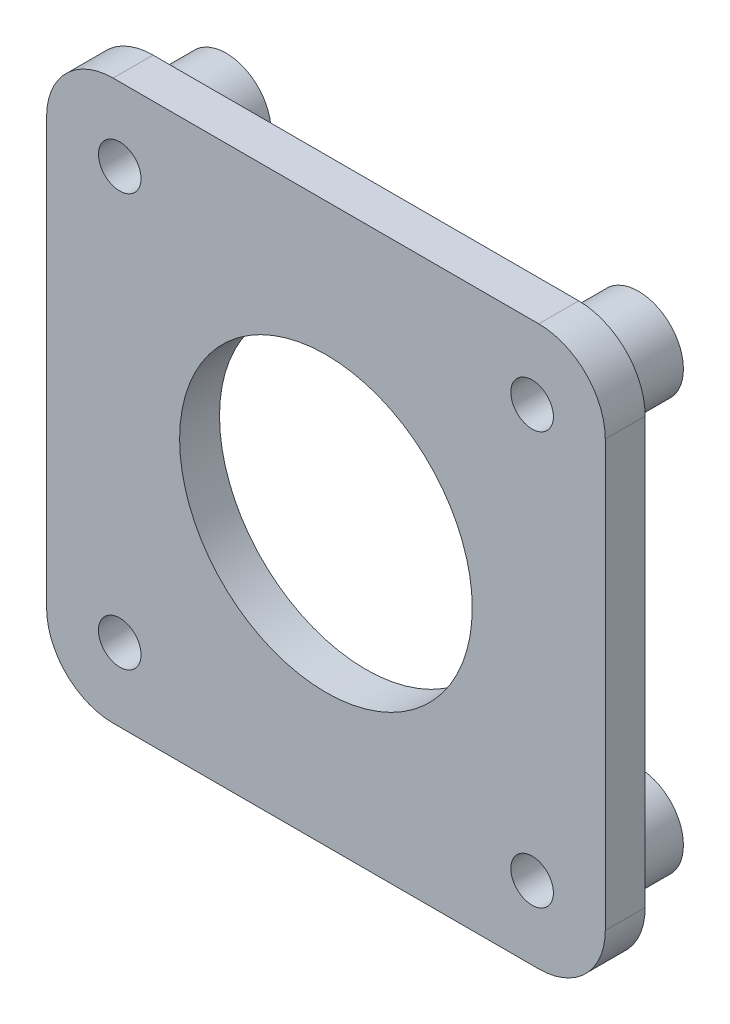
ISO-10303-21;
HEADER;
FILE_DESCRIPTION(('STEP AP214'),'2;1');
FILE_NAME('part.step','',(''),(''),'','','');
FILE_SCHEMA(('AUTOMOTIVE_DESIGN { 1 0 10303 214 1 1 1 1 }'));
ENDSEC;
DATA;
#1=APPLICATION_CONTEXT('core data for automotive mechanical design processes');
#2=APPLICATION_PROTOCOL_DEFINITION('international standard','automotive_design',2000,#1);
#3=PRODUCT_CONTEXT('',#1,'mechanical');
#4=PRODUCT('Part','Part','',(#3));
#5=PRODUCT_RELATED_PRODUCT_CATEGORY('part','',(#4));
#6=PRODUCT_DEFINITION_FORMATION('','',#4);
#7=PRODUCT_DEFINITION_CONTEXT('part definition',#1,'design');
#8=PRODUCT_DEFINITION('design','',#6,#7);
#9=PRODUCT_DEFINITION_SHAPE('','',#8);
#10=(LENGTH_UNIT() NAMED_UNIT(*) SI_UNIT(.MILLI.,.METRE.));
#11=(NAMED_UNIT(*) PLANE_ANGLE_UNIT() SI_UNIT($,.RADIAN.));
#12=(NAMED_UNIT(*) SI_UNIT($,.STERADIAN.) SOLID_ANGLE_UNIT());
#13=UNCERTAINTY_MEASURE_WITH_UNIT(LENGTH_MEASURE(1.E-05),#10,'distance_accuracy_value','');
#14=(GEOMETRIC_REPRESENTATION_CONTEXT(3) GLOBAL_UNCERTAINTY_ASSIGNED_CONTEXT((#13)) GLOBAL_UNIT_ASSIGNED_CONTEXT((#10,
#11,#12)) REPRESENTATION_CONTEXT('',''));
#15=CARTESIAN_POINT('',(0.,0.,0.));
#16=DIRECTION('',(0.,0.,1.));
#17=DIRECTION('',(1.,0.,0.));
#18=AXIS2_PLACEMENT_3D('',#15,#16,#17);
#19=CARTESIAN_POINT('',(-15.5,15.5,3.));
#20=DIRECTION('',(0.,0.,-1.));
#21=DIRECTION('',(-1.,0.,0.));
#22=AXIS2_PLACEMENT_3D('',#19,#20,#21);
#23=CYLINDRICAL_SURFACE('',#22,1.6);
#24=CARTESIAN_POINT('',(-15.5,15.5,3.));
#25=DIRECTION('',(0.,0.,1.));
#26=DIRECTION('',(1.,0.,0.));
#27=AXIS2_PLACEMENT_3D('',#24,#25,#26);
#28=CIRCLE('',#27,1.6);
#29=CARTESIAN_POINT('',(-13.9,15.5,3.));
#30=VERTEX_POINT('',#29);
#31=EDGE_CURVE('E274',#30,#30,#28,.T.);
#32=ORIENTED_EDGE('',*,*,#31,.T.);
#33=EDGE_LOOP('',(#32));
#34=FACE_BOUND('',#33,.T.);
#35=CARTESIAN_POINT('',(-15.5,15.5,-5.));
#36=DIRECTION('',(0.,0.,-1.));
#37=DIRECTION('',(-1.,0.,0.));
#38=AXIS2_PLACEMENT_3D('',#35,#36,#37);
#39=CIRCLE('',#38,1.6);
#40=CARTESIAN_POINT('',(-17.1,15.5,-5.));
#41=VERTEX_POINT('',#40);
#42=EDGE_CURVE('E154',#41,#41,#39,.T.);
#43=ORIENTED_EDGE('',*,*,#42,.T.);
#44=EDGE_LOOP('',(#43));
#45=FACE_BOUND('',#44,.T.);
#46=ADVANCED_FACE('F46',(#34,#45),#23,.F.);
#47=CARTESIAN_POINT('',(-15.5000000000002,-15.4999999999998,3.));
#48=DIRECTION('',(0.,0.,-1.));
#49=DIRECTION('',(-1.,0.,0.));
#50=AXIS2_PLACEMENT_3D('',#47,#48,#49);
#51=CYLINDRICAL_SURFACE('',#50,1.6);
#52=CARTESIAN_POINT('',(-15.5000000000002,-15.4999999999998,3.));
#53=DIRECTION('',(0.,0.,1.));
#54=DIRECTION('',(1.,0.,0.));
#55=AXIS2_PLACEMENT_3D('',#52,#53,#54);
#56=CIRCLE('',#55,1.6);
#57=CARTESIAN_POINT('',(-13.9000000000002,-15.4999999999998,3.));
#58=VERTEX_POINT('',#57);
#59=EDGE_CURVE('E266',#58,#58,#56,.T.);
#60=ORIENTED_EDGE('',*,*,#59,.T.);
#61=EDGE_LOOP('',(#60));
#62=FACE_BOUND('',#61,.T.);
#63=CARTESIAN_POINT('',(-15.5000000000002,-15.4999999999998,-5.));
#64=DIRECTION('',(0.,0.,-1.));
#65=DIRECTION('',(-1.,0.,0.));
#66=AXIS2_PLACEMENT_3D('',#63,#64,#65);
#67=CIRCLE('',#66,1.6);
#68=CARTESIAN_POINT('',(-17.1000000000002,-15.4999999999998,-5.));
#69=VERTEX_POINT('',#68);
#70=EDGE_CURVE('E252',#69,#69,#67,.T.);
#71=ORIENTED_EDGE('',*,*,#70,.T.);
#72=EDGE_LOOP('',(#71));
#73=FACE_BOUND('',#72,.T.);
#74=ADVANCED_FACE('F319',(#62,#73),#51,.F.);
#75=CARTESIAN_POINT('',(15.5000000000001,15.4999999999999,3.));
#76=DIRECTION('',(0.,0.,-1.));
#77=DIRECTION('',(-1.,0.,0.));
#78=AXIS2_PLACEMENT_3D('',#75,#76,#77);
#79=CYLINDRICAL_SURFACE('',#78,1.6);
#80=CARTESIAN_POINT('',(15.5000000000001,15.4999999999999,3.));
#81=DIRECTION('',(0.,0.,1.));
#82=DIRECTION('',(1.,0.,0.));
#83=AXIS2_PLACEMENT_3D('',#80,#81,#82);
#84=CIRCLE('',#83,1.6);
#85=CARTESIAN_POINT('',(17.1000000000001,15.4999999999999,3.));
#86=VERTEX_POINT('',#85);
#87=EDGE_CURVE('E262',#86,#86,#84,.T.);
#88=ORIENTED_EDGE('',*,*,#87,.T.);
#89=EDGE_LOOP('',(#88));
#90=FACE_BOUND('',#89,.T.);
#91=CARTESIAN_POINT('',(15.5000000000001,15.4999999999999,-5.));
#92=DIRECTION('',(0.,0.,-1.));
#93=DIRECTION('',(-1.,0.,0.));
#94=AXIS2_PLACEMENT_3D('',#91,#92,#93);
#95=CIRCLE('',#94,1.6);
#96=CARTESIAN_POINT('',(13.9000000000001,15.4999999999999,-5.));
#97=VERTEX_POINT('',#96);
#98=EDGE_CURVE('E242',#97,#97,#95,.T.);
#99=ORIENTED_EDGE('',*,*,#98,.T.);
#100=EDGE_LOOP('',(#99));
#101=FACE_BOUND('',#100,.T.);
#102=ADVANCED_FACE('F325',(#90,#101),#79,.F.);
#103=CARTESIAN_POINT('',(15.4999999999999,-15.5000000000001,3.));
#104=DIRECTION('',(0.,0.,-1.));
#105=DIRECTION('',(-1.,0.,0.));
#106=AXIS2_PLACEMENT_3D('',#103,#104,#105);
#107=CYLINDRICAL_SURFACE('',#106,1.6);
#108=CARTESIAN_POINT('',(15.4999999999999,-15.5000000000001,3.));
#109=DIRECTION('',(0.,0.,1.));
#110=DIRECTION('',(1.,0.,0.));
#111=AXIS2_PLACEMENT_3D('',#108,#109,#110);
#112=CIRCLE('',#111,1.6);
#113=CARTESIAN_POINT('',(17.0999999999999,-15.5000000000001,3.));
#114=VERTEX_POINT('',#113);
#115=EDGE_CURVE('E164',#114,#114,#112,.T.);
#116=ORIENTED_EDGE('',*,*,#115,.T.);
#117=EDGE_LOOP('',(#116));
#118=FACE_BOUND('',#117,.T.);
#119=CARTESIAN_POINT('',(15.4999999999999,-15.5000000000001,-5.));
#120=DIRECTION('',(0.,0.,-1.));
#121=DIRECTION('',(-1.,0.,0.));
#122=AXIS2_PLACEMENT_3D('',#119,#120,#121);
#123=CIRCLE('',#122,1.6);
#124=CARTESIAN_POINT('',(13.8999999999999,-15.5000000000001,-5.));
#125=VERTEX_POINT('',#124);
#126=EDGE_CURVE('E236',#125,#125,#123,.T.);
#127=ORIENTED_EDGE('',*,*,#126,.T.);
#128=EDGE_LOOP('',(#127));
#129=FACE_BOUND('',#128,.T.);
#130=ADVANCED_FACE('F229',(#118,#129),#107,.F.);
#131=CARTESIAN_POINT('',(15.5000000000001,15.4999999999999,-10.));
#132=DIRECTION('',(0.,0.,1.));
#133=DIRECTION('',(1.,0.,0.));
#134=AXIS2_PLACEMENT_3D('',#131,#132,#133);
#135=CYLINDRICAL_SURFACE('',#134,3.37445140029303);
#136=CARTESIAN_POINT('',(15.5000000000001,15.4999999999999,0.));
#137=DIRECTION('',(0.,0.,1.));
#138=DIRECTION('',(1.,0.,0.));
#139=AXIS2_PLACEMENT_3D('',#136,#137,#138);
#140=CIRCLE('',#139,3.37445140029303);
#141=CARTESIAN_POINT('',(18.8744514002931,15.4999999999999,0.));
#142=VERTEX_POINT('',#141);
#143=EDGE_CURVE('E204',#142,#142,#140,.F.);
#144=ORIENTED_EDGE('',*,*,#143,.T.);
#145=EDGE_LOOP('',(#144));
#146=FACE_BOUND('',#145,.T.);
#147=CARTESIAN_POINT('',(15.5000000000001,15.4999999999999,-5.));
#148=DIRECTION('',(0.,0.,-1.));
#149=DIRECTION('',(-1.,0.,0.));
#150=AXIS2_PLACEMENT_3D('',#147,#148,#149);
#151=CIRCLE('',#150,3.37445140029303);
#152=CARTESIAN_POINT('',(12.125548599707,15.4999999999999,-5.));
#153=VERTEX_POINT('',#152);
#154=EDGE_CURVE('E233',#153,#153,#151,.T.);
#155=ORIENTED_EDGE('',*,*,#154,.F.);
#156=EDGE_LOOP('',(#155));
#157=FACE_BOUND('',#156,.T.);
#158=ADVANCED_FACE('F225',(#146,#157),#135,.T.);
#159=CARTESIAN_POINT('',(-15.5,15.5,-10.));
#160=DIRECTION('',(0.,0.,1.));
#161=DIRECTION('',(1.,0.,0.));
#162=AXIS2_PLACEMENT_3D('',#159,#160,#161);
#163=CYLINDRICAL_SURFACE('',#162,3.37445140029303);
#164=CARTESIAN_POINT('',(-15.5,15.5,0.));
#165=DIRECTION('',(0.,0.,1.));
#166=DIRECTION('',(1.,0.,0.));
#167=AXIS2_PLACEMENT_3D('',#164,#165,#166);
#168=CIRCLE('',#167,3.37445140029303);
#169=CARTESIAN_POINT('',(-12.125548599707,15.5,0.));
#170=VERTEX_POINT('',#169);
#171=EDGE_CURVE('E208',#170,#170,#168,.F.);
#172=ORIENTED_EDGE('',*,*,#171,.T.);
#173=EDGE_LOOP('',(#172));
#174=FACE_BOUND('',#173,.T.);
#175=CARTESIAN_POINT('',(-15.5,15.5,-5.));
#176=DIRECTION('',(0.,0.,-1.));
#177=DIRECTION('',(-1.,0.,0.));
#178=AXIS2_PLACEMENT_3D('',#175,#176,#177);
#179=CIRCLE('',#178,3.37445140029303);
#180=CARTESIAN_POINT('',(-18.874451400293,15.5,-5.));
#181=VERTEX_POINT('',#180);
#182=EDGE_CURVE('E237',#181,#181,#179,.T.);
#183=ORIENTED_EDGE('',*,*,#182,.F.);
#184=EDGE_LOOP('',(#183));
#185=FACE_BOUND('',#184,.T.);
#186=ADVANCED_FACE('F228',(#174,#185),#163,.T.);
#187=CARTESIAN_POINT('',(-15.4999999999999,-15.5000000000001,-10.));
#188=DIRECTION('',(0.,0.,1.));
#189=DIRECTION('',(1.,0.,0.));
#190=AXIS2_PLACEMENT_3D('',#187,#188,#189);
#191=CYLINDRICAL_SURFACE('',#190,3.37445140029303);
#192=CARTESIAN_POINT('',(-15.4999999999999,-15.5000000000001,0.));
#193=DIRECTION('',(0.,0.,1.));
#194=DIRECTION('',(1.,0.,0.));
#195=AXIS2_PLACEMENT_3D('',#192,#193,#194);
#196=CIRCLE('',#195,3.37445140029303);
#197=CARTESIAN_POINT('',(-12.1255485997069,-15.5000000000001,0.));
#198=VERTEX_POINT('',#197);
#199=EDGE_CURVE('E56',#198,#198,#196,.F.);
#200=ORIENTED_EDGE('',*,*,#199,.T.);
#201=EDGE_LOOP('',(#200));
#202=FACE_BOUND('',#201,.T.);
#203=CARTESIAN_POINT('',(-15.4999999999999,-15.5000000000001,-5.));
#204=DIRECTION('',(0.,0.,-1.));
#205=DIRECTION('',(-1.,0.,0.));
#206=AXIS2_PLACEMENT_3D('',#203,#204,#205);
#207=CIRCLE('',#206,3.37445140029303);
#208=CARTESIAN_POINT('',(-18.874451400293,-15.5000000000001,-5.));
#209=VERTEX_POINT('',#208);
#210=EDGE_CURVE('E245',#209,#209,#207,.T.);
#211=ORIENTED_EDGE('',*,*,#210,.F.);
#212=EDGE_LOOP('',(#211));
#213=FACE_BOUND('',#212,.T.);
#214=ADVANCED_FACE('F216',(#202,#213),#191,.T.);
#215=CARTESIAN_POINT('',(15.5000000000001,-15.4999999999999,-10.));
#216=DIRECTION('',(0.,0.,1.));
#217=DIRECTION('',(1.,0.,0.));
#218=AXIS2_PLACEMENT_3D('',#215,#216,#217);
#219=CYLINDRICAL_SURFACE('',#218,3.37445140029303);
#220=CARTESIAN_POINT('',(15.5000000000001,-15.4999999999999,0.));
#221=DIRECTION('',(0.,0.,1.));
#222=DIRECTION('',(1.,0.,0.));
#223=AXIS2_PLACEMENT_3D('',#220,#221,#222);
#224=CIRCLE('',#223,3.37445140029303);
#225=CARTESIAN_POINT('',(18.8744514002931,-15.4999999999999,0.));
#226=VERTEX_POINT('',#225);
#227=EDGE_CURVE('E11',#226,#226,#224,.F.);
#228=ORIENTED_EDGE('',*,*,#227,.T.);
#229=EDGE_LOOP('',(#228));
#230=FACE_BOUND('',#229,.T.);
#231=CARTESIAN_POINT('',(15.5000000000001,-15.4999999999999,-5.));
#232=DIRECTION('',(0.,0.,-1.));
#233=DIRECTION('',(-1.,0.,0.));
#234=AXIS2_PLACEMENT_3D('',#231,#232,#233);
#235=CIRCLE('',#234,3.37445140029303);
#236=CARTESIAN_POINT('',(12.1255485997071,-15.4999999999999,-5.));
#237=VERTEX_POINT('',#236);
#238=EDGE_CURVE('E50',#237,#237,#235,.T.);
#239=ORIENTED_EDGE('',*,*,#238,.F.);
#240=EDGE_LOOP('',(#239));
#241=FACE_BOUND('',#240,.T.);
#242=ADVANCED_FACE('F221',(#230,#241),#219,.T.);
#243=CARTESIAN_POINT('',(0.,0.,0.));
#244=DIRECTION('',(0.,0.,1.));
#245=DIRECTION('',(1.,0.,0.));
#246=AXIS2_PLACEMENT_3D('',#243,#244,#245);
#247=PLANE('',#246);
#248=ORIENTED_EDGE('',*,*,#199,.F.);
#249=EDGE_LOOP('',(#248));
#250=FACE_BOUND('',#249,.T.);
#251=ORIENTED_EDGE('',*,*,#143,.F.);
#252=EDGE_LOOP('',(#251));
#253=FACE_BOUND('',#252,.T.);
#254=DIRECTION('',(1.,0.,0.));
#255=VECTOR('',#254,1.);
#256=CARTESIAN_POINT('',(0.,-21.,0.));
#257=LINE('',#256,#255);
#258=CARTESIAN_POINT('',(-16.,-21.,0.));
#259=VERTEX_POINT('',#258);
#260=CARTESIAN_POINT('',(16.,-21.,0.));
#261=VERTEX_POINT('',#260);
#262=EDGE_CURVE('E133',#259,#261,#257,.T.);
#263=ORIENTED_EDGE('',*,*,#262,.F.);
#264=CARTESIAN_POINT('',(-16.,-16.,0.));
#265=DIRECTION('',(0.,0.,1.));
#266=DIRECTION('',(1.,0.,0.));
#267=AXIS2_PLACEMENT_3D('',#264,#265,#266);
#268=CIRCLE('',#267,5.);
#269=CARTESIAN_POINT('',(-21.,-16.,0.));
#270=VERTEX_POINT('',#269);
#271=EDGE_CURVE('E115',#259,#270,#268,.F.);
#272=ORIENTED_EDGE('',*,*,#271,.T.);
#273=DIRECTION('',(0.,1.,0.));
#274=VECTOR('',#273,1.);
#275=CARTESIAN_POINT('',(-21.,0.,0.));
#276=LINE('',#275,#274);
#277=CARTESIAN_POINT('',(-21.,16.,0.));
#278=VERTEX_POINT('',#277);
#279=EDGE_CURVE('E161',#270,#278,#276,.T.);
#280=ORIENTED_EDGE('',*,*,#279,.T.);
#281=CARTESIAN_POINT('',(-16.,16.,0.));
#282=DIRECTION('',(0.,0.,1.));
#283=DIRECTION('',(1.,0.,0.));
#284=AXIS2_PLACEMENT_3D('',#281,#282,#283);
#285=CIRCLE('',#284,5.);
#286=CARTESIAN_POINT('',(-16.,21.,0.));
#287=VERTEX_POINT('',#286);
#288=EDGE_CURVE('E138',#278,#287,#285,.F.);
#289=ORIENTED_EDGE('',*,*,#288,.T.);
#290=DIRECTION('',(1.,0.,0.));
#291=VECTOR('',#290,1.);
#292=CARTESIAN_POINT('',(0.,21.,0.));
#293=LINE('',#292,#291);
#294=CARTESIAN_POINT('',(16.,21.,0.));
#295=VERTEX_POINT('',#294);
#296=EDGE_CURVE('E151',#287,#295,#293,.T.);
#297=ORIENTED_EDGE('',*,*,#296,.T.);
#298=CARTESIAN_POINT('',(16.,16.,0.));
#299=DIRECTION('',(0.,0.,1.));
#300=DIRECTION('',(1.,0.,0.));
#301=AXIS2_PLACEMENT_3D('',#298,#299,#300);
#302=CIRCLE('',#301,5.);
#303=CARTESIAN_POINT('',(21.,16.,0.));
#304=VERTEX_POINT('',#303);
#305=EDGE_CURVE('E170',#295,#304,#302,.F.);
#306=ORIENTED_EDGE('',*,*,#305,.T.);
#307=DIRECTION('',(0.,1.,0.));
#308=VECTOR('',#307,1.);
#309=CARTESIAN_POINT('',(21.,0.,0.));
#310=LINE('',#309,#308);
#311=CARTESIAN_POINT('',(21.,-16.,0.));
#312=VERTEX_POINT('',#311);
#313=EDGE_CURVE('E145',#312,#304,#310,.T.);
#314=ORIENTED_EDGE('',*,*,#313,.F.);
#315=CARTESIAN_POINT('',(16.,-16.,0.));
#316=DIRECTION('',(0.,0.,1.));
#317=DIRECTION('',(1.,0.,0.));
#318=AXIS2_PLACEMENT_3D('',#315,#316,#317);
#319=CIRCLE('',#318,5.);
#320=EDGE_CURVE('E127',#312,#261,#319,.F.);
#321=ORIENTED_EDGE('',*,*,#320,.T.);
#322=EDGE_LOOP('',(#263,#272,#280,#289,#297,#306,#314,#321));
#323=FACE_BOUND('',#322,.T.);
#324=CARTESIAN_POINT('',(0.,0.,0.));
#325=DIRECTION('',(0.,0.,1.));
#326=DIRECTION('',(1.,0.,0.));
#327=AXIS2_PLACEMENT_3D('',#324,#325,#326);
#328=CIRCLE('',#327,11.);
#329=CARTESIAN_POINT('',(11.,0.,0.));
#330=VERTEX_POINT('',#329);
#331=EDGE_CURVE('E146',#330,#330,#328,.T.);
#332=ORIENTED_EDGE('',*,*,#331,.T.);
#333=EDGE_LOOP('',(#332));
#334=FACE_BOUND('',#333,.T.);
#335=ORIENTED_EDGE('',*,*,#171,.F.);
#336=EDGE_LOOP('',(#335));
#337=FACE_BOUND('',#336,.T.);
#338=ORIENTED_EDGE('',*,*,#227,.F.);
#339=EDGE_LOOP('',(#338));
#340=FACE_BOUND('',#339,.T.);
#341=ADVANCED_FACE('F141',(#250,#253,#323,#334,#337,#340),#247,.F.);
#342=CARTESIAN_POINT('',(0.,-21.,3.));
#343=DIRECTION('',(0.,1.,0.));
#344=DIRECTION('',(0.,0.,1.));
#345=AXIS2_PLACEMENT_3D('',#342,#343,#344);
#346=PLANE('',#345);
#347=DIRECTION('',(1.,0.,0.));
#348=VECTOR('',#347,1.);
#349=CARTESIAN_POINT('',(0.,-21.,3.));
#350=LINE('',#349,#348);
#351=CARTESIAN_POINT('',(-16.,-21.,3.));
#352=VERTEX_POINT('',#351);
#353=CARTESIAN_POINT('',(16.,-21.,3.));
#354=VERTEX_POINT('',#353);
#355=EDGE_CURVE('E136',#352,#354,#350,.T.);
#356=ORIENTED_EDGE('',*,*,#355,.F.);
#357=DIRECTION('',(0.,0.,-1.));
#358=VECTOR('',#357,1.);
#359=CARTESIAN_POINT('',(-16.,-21.,0.));
#360=LINE('',#359,#358);
#361=EDGE_CURVE('E119',#352,#259,#360,.T.);
#362=ORIENTED_EDGE('',*,*,#361,.T.);
#363=ORIENTED_EDGE('',*,*,#262,.T.);
#364=DIRECTION('',(0.,0.,-1.));
#365=VECTOR('',#364,1.);
#366=CARTESIAN_POINT('',(16.,-21.,3.));
#367=LINE('',#366,#365);
#368=EDGE_CURVE('E139',#261,#354,#367,.F.);
#369=ORIENTED_EDGE('',*,*,#368,.T.);
#370=EDGE_LOOP('',(#356,#362,#363,#369));
#371=FACE_BOUND('',#370,.T.);
#372=ADVANCED_FACE('F132',(#371),#346,.F.);
#373=CARTESIAN_POINT('',(21.,0.,3.));
#374=DIRECTION('',(-1.,0.,0.));
#375=DIRECTION('',(0.,0.,1.));
#376=AXIS2_PLACEMENT_3D('',#373,#374,#375);
#377=PLANE('',#376);
#378=DIRECTION('',(0.,1.,0.));
#379=VECTOR('',#378,1.);
#380=CARTESIAN_POINT('',(21.,0.,3.));
#381=LINE('',#380,#379);
#382=CARTESIAN_POINT('',(21.,-16.,3.));
#383=VERTEX_POINT('',#382);
#384=CARTESIAN_POINT('',(21.,16.,3.));
#385=VERTEX_POINT('',#384);
#386=EDGE_CURVE('E280',#383,#385,#381,.T.);
#387=ORIENTED_EDGE('',*,*,#386,.F.);
#388=DIRECTION('',(0.,0.,-1.));
#389=VECTOR('',#388,1.);
#390=CARTESIAN_POINT('',(21.,-16.,3.));
#391=LINE('',#390,#389);
#392=EDGE_CURVE('E194',#383,#312,#391,.T.);
#393=ORIENTED_EDGE('',*,*,#392,.T.);
#394=ORIENTED_EDGE('',*,*,#313,.T.);
#395=DIRECTION('',(0.,0.,-1.));
#396=VECTOR('',#395,1.);
#397=CARTESIAN_POINT('',(21.,16.,3.));
#398=LINE('',#397,#396);
#399=EDGE_CURVE('E191',#304,#385,#398,.F.);
#400=ORIENTED_EDGE('',*,*,#399,.T.);
#401=EDGE_LOOP('',(#387,#393,#394,#400));
#402=FACE_BOUND('',#401,.T.);
#403=ADVANCED_FACE('F300',(#402),#377,.F.);
#404=CARTESIAN_POINT('',(0.,21.,3.));
#405=DIRECTION('',(0.,1.,0.));
#406=DIRECTION('',(0.,0.,1.));
#407=AXIS2_PLACEMENT_3D('',#404,#405,#406);
#408=PLANE('',#407);
#409=DIRECTION('',(1.,0.,0.));
#410=VECTOR('',#409,1.);
#411=CARTESIAN_POINT('',(0.,21.,3.));
#412=LINE('',#411,#410);
#413=CARTESIAN_POINT('',(-16.,21.,3.));
#414=VERTEX_POINT('',#413);
#415=CARTESIAN_POINT('',(16.,21.,3.));
#416=VERTEX_POINT('',#415);
#417=EDGE_CURVE('E283',#414,#416,#412,.T.);
#418=ORIENTED_EDGE('',*,*,#417,.T.);
#419=DIRECTION('',(0.,0.,-1.));
#420=VECTOR('',#419,1.);
#421=CARTESIAN_POINT('',(16.,21.,0.));
#422=LINE('',#421,#420);
#423=EDGE_CURVE('E200',#416,#295,#422,.T.);
#424=ORIENTED_EDGE('',*,*,#423,.T.);
#425=ORIENTED_EDGE('',*,*,#296,.F.);
#426=DIRECTION('',(0.,0.,-1.));
#427=VECTOR('',#426,1.);
#428=CARTESIAN_POINT('',(-16.,21.,3.));
#429=LINE('',#428,#427);
#430=EDGE_CURVE('E70',#287,#414,#429,.F.);
#431=ORIENTED_EDGE('',*,*,#430,.T.);
#432=EDGE_LOOP('',(#418,#424,#425,#431));
#433=FACE_BOUND('',#432,.T.);
#434=ADVANCED_FACE('F293',(#433),#408,.T.);
#435=CARTESIAN_POINT('',(0.,0.,3.));
#436=DIRECTION('',(0.,0.,-1.));
#437=DIRECTION('',(-1.,0.,0.));
#438=AXIS2_PLACEMENT_3D('',#435,#436,#437);
#439=CYLINDRICAL_SURFACE('',#438,11.);
#440=CARTESIAN_POINT('',(0.,0.,3.));
#441=DIRECTION('',(0.,0.,1.));
#442=DIRECTION('',(1.,0.,0.));
#443=AXIS2_PLACEMENT_3D('',#440,#441,#442);
#444=CIRCLE('',#443,11.);
#445=CARTESIAN_POINT('',(11.,0.,3.));
#446=VERTEX_POINT('',#445);
#447=EDGE_CURVE('E270',#446,#446,#444,.T.);
#448=ORIENTED_EDGE('',*,*,#447,.T.);
#449=EDGE_LOOP('',(#448));
#450=FACE_BOUND('',#449,.T.);
#451=ORIENTED_EDGE('',*,*,#331,.F.);
#452=EDGE_LOOP('',(#451));
#453=FACE_BOUND('',#452,.T.);
#454=ADVANCED_FACE('F314',(#450,#453),#439,.F.);
#455=CARTESIAN_POINT('',(-21.,0.,3.));
#456=DIRECTION('',(-1.,0.,0.));
#457=DIRECTION('',(0.,0.,1.));
#458=AXIS2_PLACEMENT_3D('',#455,#456,#457);
#459=PLANE('',#458);
#460=ORIENTED_EDGE('',*,*,#279,.F.);
#461=DIRECTION('',(0.,0.,-1.));
#462=VECTOR('',#461,1.);
#463=CARTESIAN_POINT('',(-21.,-16.,3.));
#464=LINE('',#463,#462);
#465=CARTESIAN_POINT('',(-21.,-16.,3.));
#466=VERTEX_POINT('',#465);
#467=EDGE_CURVE('E120',#270,#466,#464,.F.);
#468=ORIENTED_EDGE('',*,*,#467,.T.);
#469=DIRECTION('',(0.,1.,0.));
#470=VECTOR('',#469,1.);
#471=CARTESIAN_POINT('',(-21.,0.,3.));
#472=LINE('',#471,#470);
#473=CARTESIAN_POINT('',(-21.,16.,3.));
#474=VERTEX_POINT('',#473);
#475=EDGE_CURVE('E166',#466,#474,#472,.T.);
#476=ORIENTED_EDGE('',*,*,#475,.T.);
#477=DIRECTION('',(0.,0.,-1.));
#478=VECTOR('',#477,1.);
#479=CARTESIAN_POINT('',(-21.,16.,3.));
#480=LINE('',#479,#478);
#481=EDGE_CURVE('E126',#474,#278,#480,.T.);
#482=ORIENTED_EDGE('',*,*,#481,.T.);
#483=EDGE_LOOP('',(#460,#468,#476,#482));
#484=FACE_BOUND('',#483,.T.);
#485=ADVANCED_FACE('F290',(#484),#459,.T.);
#486=CARTESIAN_POINT('',(0.,0.,3.));
#487=DIRECTION('',(0.,0.,1.));
#488=DIRECTION('',(1.,0.,0.));
#489=AXIS2_PLACEMENT_3D('',#486,#487,#488);
#490=PLANE('',#489);
#491=ORIENTED_EDGE('',*,*,#115,.F.);
#492=EDGE_LOOP('',(#491));
#493=FACE_BOUND('',#492,.T.);
#494=ORIENTED_EDGE('',*,*,#87,.F.);
#495=EDGE_LOOP('',(#494));
#496=FACE_BOUND('',#495,.T.);
#497=ORIENTED_EDGE('',*,*,#59,.F.);
#498=EDGE_LOOP('',(#497));
#499=FACE_BOUND('',#498,.T.);
#500=ORIENTED_EDGE('',*,*,#447,.F.);
#501=EDGE_LOOP('',(#500));
#502=FACE_BOUND('',#501,.T.);
#503=ORIENTED_EDGE('',*,*,#31,.F.);
#504=EDGE_LOOP('',(#503));
#505=FACE_BOUND('',#504,.T.);
#506=ORIENTED_EDGE('',*,*,#475,.F.);
#507=CARTESIAN_POINT('',(-16.,-16.,3.));
#508=DIRECTION('',(0.,0.,1.));
#509=DIRECTION('',(1.,0.,0.));
#510=AXIS2_PLACEMENT_3D('',#507,#508,#509);
#511=CIRCLE('',#510,5.);
#512=EDGE_CURVE('E188',#466,#352,#511,.T.);
#513=ORIENTED_EDGE('',*,*,#512,.T.);
#514=ORIENTED_EDGE('',*,*,#355,.T.);
#515=CARTESIAN_POINT('',(16.,-16.,3.));
#516=DIRECTION('',(0.,0.,1.));
#517=DIRECTION('',(1.,0.,0.));
#518=AXIS2_PLACEMENT_3D('',#515,#516,#517);
#519=CIRCLE('',#518,5.);
#520=EDGE_CURVE('E185',#354,#383,#519,.T.);
#521=ORIENTED_EDGE('',*,*,#520,.T.);
#522=ORIENTED_EDGE('',*,*,#386,.T.);
#523=CARTESIAN_POINT('',(16.,16.,3.));
#524=DIRECTION('',(0.,0.,1.));
#525=DIRECTION('',(1.,0.,0.));
#526=AXIS2_PLACEMENT_3D('',#523,#524,#525);
#527=CIRCLE('',#526,5.);
#528=EDGE_CURVE('E63',#385,#416,#527,.T.);
#529=ORIENTED_EDGE('',*,*,#528,.T.);
#530=ORIENTED_EDGE('',*,*,#417,.F.);
#531=CARTESIAN_POINT('',(-16.,16.,3.));
#532=DIRECTION('',(0.,0.,1.));
#533=DIRECTION('',(1.,0.,0.));
#534=AXIS2_PLACEMENT_3D('',#531,#532,#533);
#535=CIRCLE('',#534,5.);
#536=EDGE_CURVE('E180',#414,#474,#535,.T.);
#537=ORIENTED_EDGE('',*,*,#536,.T.);
#538=EDGE_LOOP('',(#506,#513,#514,#521,#522,#529,#530,#537));
#539=FACE_BOUND('',#538,.T.);
#540=ADVANCED_FACE('F305',(#493,#496,#499,#502,#505,#539),#490,.T.);
#541=CARTESIAN_POINT('',(-16.,-16.,3.));
#542=DIRECTION('',(0.,0.,1.));
#543=DIRECTION('',(1.,0.,0.));
#544=AXIS2_PLACEMENT_3D('',#541,#542,#543);
#545=CYLINDRICAL_SURFACE('',#544,5.);
#546=ORIENTED_EDGE('',*,*,#512,.F.);
#547=ORIENTED_EDGE('',*,*,#467,.F.);
#548=ORIENTED_EDGE('',*,*,#271,.F.);
#549=ORIENTED_EDGE('',*,*,#361,.F.);
#550=EDGE_LOOP('',(#546,#547,#548,#549));
#551=FACE_BOUND('',#550,.T.);
#552=ADVANCED_FACE('F118',(#551),#545,.T.);
#553=CARTESIAN_POINT('',(16.,-16.,3.));
#554=DIRECTION('',(0.,0.,-1.));
#555=DIRECTION('',(-1.,0.,0.));
#556=AXIS2_PLACEMENT_3D('',#553,#554,#555);
#557=CYLINDRICAL_SURFACE('',#556,5.);
#558=ORIENTED_EDGE('',*,*,#520,.F.);
#559=ORIENTED_EDGE('',*,*,#368,.F.);
#560=ORIENTED_EDGE('',*,*,#320,.F.);
#561=ORIENTED_EDGE('',*,*,#392,.F.);
#562=EDGE_LOOP('',(#558,#559,#560,#561));
#563=FACE_BOUND('',#562,.T.);
#564=ADVANCED_FACE('F304',(#563),#557,.T.);
#565=CARTESIAN_POINT('',(16.,16.,3.));
#566=DIRECTION('',(0.,0.,1.));
#567=DIRECTION('',(1.,0.,0.));
#568=AXIS2_PLACEMENT_3D('',#565,#566,#567);
#569=CYLINDRICAL_SURFACE('',#568,5.);
#570=ORIENTED_EDGE('',*,*,#528,.F.);
#571=ORIENTED_EDGE('',*,*,#399,.F.);
#572=ORIENTED_EDGE('',*,*,#305,.F.);
#573=ORIENTED_EDGE('',*,*,#423,.F.);
#574=EDGE_LOOP('',(#570,#571,#572,#573));
#575=FACE_BOUND('',#574,.T.);
#576=ADVANCED_FACE('F296',(#575),#569,.T.);
#577=CARTESIAN_POINT('',(-16.,16.,3.));
#578=DIRECTION('',(0.,0.,-1.));
#579=DIRECTION('',(-1.,0.,0.));
#580=AXIS2_PLACEMENT_3D('',#577,#578,#579);
#581=CYLINDRICAL_SURFACE('',#580,5.);
#582=ORIENTED_EDGE('',*,*,#536,.F.);
#583=ORIENTED_EDGE('',*,*,#430,.F.);
#584=ORIENTED_EDGE('',*,*,#288,.F.);
#585=ORIENTED_EDGE('',*,*,#481,.F.);
#586=EDGE_LOOP('',(#582,#583,#584,#585));
#587=FACE_BOUND('',#586,.T.);
#588=ADVANCED_FACE('F48',(#587),#581,.T.);
#589=CARTESIAN_POINT('',(0.,0.,-5.));
#590=DIRECTION('',(0.,0.,-1.));
#591=DIRECTION('',(-1.,0.,0.));
#592=AXIS2_PLACEMENT_3D('',#589,#590,#591);
#593=PLANE('',#592);
#594=ORIENTED_EDGE('',*,*,#126,.F.);
#595=EDGE_LOOP('',(#594));
#596=FACE_BOUND('',#595,.T.);
#597=ORIENTED_EDGE('',*,*,#238,.T.);
#598=EDGE_LOOP('',(#597));
#599=FACE_BOUND('',#598,.T.);
#600=ADVANCED_FACE('F346',(#596,#599),#593,.T.);
#601=ORIENTED_EDGE('',*,*,#70,.F.);
#602=EDGE_LOOP('',(#601));
#603=FACE_BOUND('',#602,.T.);
#604=ORIENTED_EDGE('',*,*,#210,.T.);
#605=EDGE_LOOP('',(#604));
#606=FACE_BOUND('',#605,.T.);
#607=ADVANCED_FACE('F350',(#603,#606),#593,.T.);
#608=ORIENTED_EDGE('',*,*,#42,.F.);
#609=EDGE_LOOP('',(#608));
#610=FACE_BOUND('',#609,.T.);
#611=ORIENTED_EDGE('',*,*,#182,.T.);
#612=EDGE_LOOP('',(#611));
#613=FACE_BOUND('',#612,.T.);
#614=ADVANCED_FACE('F358',(#610,#613),#593,.T.);
#615=ORIENTED_EDGE('',*,*,#98,.F.);
#616=EDGE_LOOP('',(#615));
#617=FACE_BOUND('',#616,.T.);
#618=ORIENTED_EDGE('',*,*,#154,.T.);
#619=EDGE_LOOP('',(#618));
#620=FACE_BOUND('',#619,.T.);
#621=ADVANCED_FACE('F353',(#617,#620),#593,.T.);
#622=CLOSED_SHELL('',(#46,#74,#102,#130,#158,#186,#214,#242,#341,#372,#403,#434,#454,#485,#540,
#552,#564,#576,#588,#600,#607,#614,#621));
#623=MANIFOLD_SOLID_BREP('B2',#622);
#624=ADVANCED_BREP_SHAPE_REPRESENTATION('',(#18,#623),#14);
#625=SHAPE_DEFINITION_REPRESENTATION(#9,#624);
ENDSEC;
END-ISO-10303-21;
